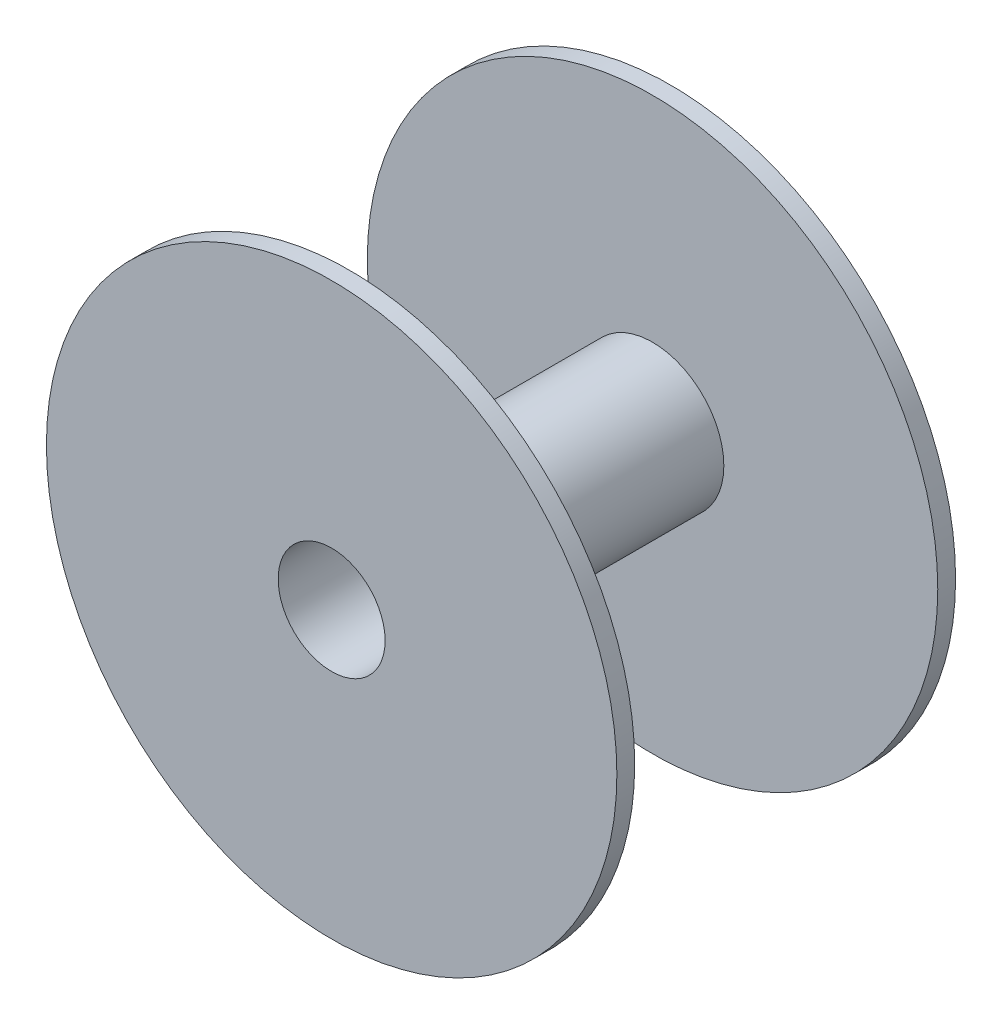
ISO-10303-21;
HEADER;
FILE_DESCRIPTION(('STEP AP214'),'2;1');
FILE_NAME('part.step','',(''),(''),'','','');
FILE_SCHEMA(('AUTOMOTIVE_DESIGN { 1 0 10303 214 1 1 1 1 }'));
ENDSEC;
DATA;
#1=APPLICATION_CONTEXT('core data for automotive mechanical design processes');
#2=APPLICATION_PROTOCOL_DEFINITION('international standard','automotive_design',2000,#1);
#3=PRODUCT_CONTEXT('',#1,'mechanical');
#4=PRODUCT('Part','Part','',(#3));
#5=PRODUCT_RELATED_PRODUCT_CATEGORY('part','',(#4));
#6=PRODUCT_DEFINITION_FORMATION('','',#4);
#7=PRODUCT_DEFINITION_CONTEXT('part definition',#1,'design');
#8=PRODUCT_DEFINITION('design','',#6,#7);
#9=PRODUCT_DEFINITION_SHAPE('','',#8);
#10=(LENGTH_UNIT() NAMED_UNIT(*) SI_UNIT(.MILLI.,.METRE.));
#11=(NAMED_UNIT(*) PLANE_ANGLE_UNIT() SI_UNIT($,.RADIAN.));
#12=(NAMED_UNIT(*) SI_UNIT($,.STERADIAN.) SOLID_ANGLE_UNIT());
#13=UNCERTAINTY_MEASURE_WITH_UNIT(LENGTH_MEASURE(1.E-05),#10,'distance_accuracy_value','');
#14=(GEOMETRIC_REPRESENTATION_CONTEXT(3) GLOBAL_UNCERTAINTY_ASSIGNED_CONTEXT((#13)) GLOBAL_UNIT_ASSIGNED_CONTEXT((#10,
#11,#12)) REPRESENTATION_CONTEXT('',''));
#15=CARTESIAN_POINT('',(0.,0.,0.));
#16=DIRECTION('',(0.,0.,1.));
#17=DIRECTION('',(1.,0.,0.));
#18=AXIS2_PLACEMENT_3D('',#15,#16,#17);
#19=CARTESIAN_POINT('',(0.,0.,95.));
#20=DIRECTION('',(0.,0.,-1.));
#21=DIRECTION('',(-1.,0.,0.));
#22=AXIS2_PLACEMENT_3D('',#19,#20,#21);
#23=CYLINDRICAL_SURFACE('',#22,80.);
#24=CARTESIAN_POINT('',(0.,0.,0.));
#25=DIRECTION('',(0.,0.,1.));
#26=DIRECTION('',(1.,0.,0.));
#27=AXIS2_PLACEMENT_3D('',#24,#25,#26);
#28=CIRCLE('',#27,80.);
#29=CARTESIAN_POINT('',(80.,0.,0.));
#30=VERTEX_POINT('',#29);
#31=EDGE_CURVE('E35',#30,#30,#28,.T.);
#32=ORIENTED_EDGE('',*,*,#31,.T.);
#33=EDGE_LOOP('',(#32));
#34=FACE_BOUND('',#33,.T.);
#35=CARTESIAN_POINT('',(0.,0.,5.));
#36=DIRECTION('',(0.,0.,1.));
#37=DIRECTION('',(1.,0.,0.));
#38=AXIS2_PLACEMENT_3D('',#35,#36,#37);
#39=CIRCLE('',#38,80.);
#40=CARTESIAN_POINT('',(80.,0.,5.));
#41=VERTEX_POINT('',#40);
#42=EDGE_CURVE('E50',#41,#41,#39,.T.);
#43=ORIENTED_EDGE('',*,*,#42,.F.);
#44=EDGE_LOOP('',(#43));
#45=FACE_BOUND('',#44,.T.);
#46=ADVANCED_FACE('F31',(#34,#45),#23,.T.);
#47=CARTESIAN_POINT('',(0.,0.,95.));
#48=DIRECTION('',(0.,0.,1.));
#49=DIRECTION('',(1.,0.,0.));
#50=AXIS2_PLACEMENT_3D('',#47,#48,#49);
#51=PLANE('',#50);
#52=CARTESIAN_POINT('',(0.,0.,95.));
#53=DIRECTION('',(0.,0.,1.));
#54=DIRECTION('',(1.,0.,0.));
#55=AXIS2_PLACEMENT_3D('',#52,#53,#54);
#56=CIRCLE('',#55,80.);
#57=CARTESIAN_POINT('',(80.,0.,95.));
#58=VERTEX_POINT('',#57);
#59=EDGE_CURVE('E10',#58,#58,#56,.T.);
#60=ORIENTED_EDGE('',*,*,#59,.T.);
#61=EDGE_LOOP('',(#60));
#62=FACE_BOUND('',#61,.T.);
#63=CARTESIAN_POINT('',(0.,0.,95.));
#64=DIRECTION('',(0.,0.,1.));
#65=DIRECTION('',(1.,0.,0.));
#66=AXIS2_PLACEMENT_3D('',#63,#64,#65);
#67=CIRCLE('',#66,15.);
#68=CARTESIAN_POINT('',(15.,0.,95.));
#69=VERTEX_POINT('',#68);
#70=EDGE_CURVE('E42',#69,#69,#67,.T.);
#71=ORIENTED_EDGE('',*,*,#70,.F.);
#72=EDGE_LOOP('',(#71));
#73=FACE_BOUND('',#72,.T.);
#74=ADVANCED_FACE('F81',(#62,#73),#51,.T.);
#75=CARTESIAN_POINT('',(0.,0.,0.));
#76=DIRECTION('',(0.,0.,1.));
#77=DIRECTION('',(1.,0.,0.));
#78=AXIS2_PLACEMENT_3D('',#75,#76,#77);
#79=PLANE('',#78);
#80=ORIENTED_EDGE('',*,*,#31,.F.);
#81=EDGE_LOOP('',(#80));
#82=FACE_BOUND('',#81,.T.);
#83=CARTESIAN_POINT('',(0.,0.,0.));
#84=DIRECTION('',(0.,0.,1.));
#85=DIRECTION('',(1.,0.,0.));
#86=AXIS2_PLACEMENT_3D('',#83,#84,#85);
#87=CIRCLE('',#86,15.);
#88=CARTESIAN_POINT('',(15.,0.,0.));
#89=VERTEX_POINT('',#88);
#90=EDGE_CURVE('E44',#89,#89,#87,.T.);
#91=ORIENTED_EDGE('',*,*,#90,.T.);
#92=EDGE_LOOP('',(#91));
#93=FACE_BOUND('',#92,.T.);
#94=ADVANCED_FACE('F86',(#82,#93),#79,.F.);
#95=CARTESIAN_POINT('',(0.,0.,90.));
#96=DIRECTION('',(0.,0.,1.));
#97=DIRECTION('',(1.,0.,0.));
#98=AXIS2_PLACEMENT_3D('',#95,#96,#97);
#99=CIRCLE('',#98,80.);
#100=CARTESIAN_POINT('',(80.,0.,90.));
#101=VERTEX_POINT('',#100);
#102=EDGE_CURVE('E47',#101,#101,#99,.T.);
#103=ORIENTED_EDGE('',*,*,#102,.T.);
#104=EDGE_LOOP('',(#103));
#105=FACE_BOUND('',#104,.T.);
#106=ORIENTED_EDGE('',*,*,#59,.F.);
#107=EDGE_LOOP('',(#106));
#108=FACE_BOUND('',#107,.T.);
#109=ADVANCED_FACE('F33',(#105,#108),#23,.T.);
#110=CARTESIAN_POINT('',(0.,0.,95.));
#111=DIRECTION('',(0.,0.,-1.));
#112=DIRECTION('',(-1.,0.,0.));
#113=AXIS2_PLACEMENT_3D('',#110,#111,#112);
#114=CYLINDRICAL_SURFACE('',#113,15.);
#115=ORIENTED_EDGE('',*,*,#70,.T.);
#116=EDGE_LOOP('',(#115));
#117=FACE_BOUND('',#116,.T.);
#118=ORIENTED_EDGE('',*,*,#90,.F.);
#119=EDGE_LOOP('',(#118));
#120=FACE_BOUND('',#119,.T.);
#121=ADVANCED_FACE('F77',(#117,#120),#114,.F.);
#122=CARTESIAN_POINT('',(0.,0.,90.));
#123=DIRECTION('',(0.,0.,1.));
#124=DIRECTION('',(1.,0.,0.));
#125=AXIS2_PLACEMENT_3D('',#122,#123,#124);
#126=PLANE('',#125);
#127=ORIENTED_EDGE('',*,*,#102,.F.);
#128=EDGE_LOOP('',(#127));
#129=FACE_BOUND('',#128,.T.);
#130=CARTESIAN_POINT('',(0.,0.,90.));
#131=DIRECTION('',(0.,0.,1.));
#132=DIRECTION('',(1.,0.,0.));
#133=AXIS2_PLACEMENT_3D('',#130,#131,#132);
#134=CIRCLE('',#133,20.);
#135=CARTESIAN_POINT('',(20.,0.,90.));
#136=VERTEX_POINT('',#135);
#137=EDGE_CURVE('E53',#136,#136,#134,.T.);
#138=ORIENTED_EDGE('',*,*,#137,.T.);
#139=EDGE_LOOP('',(#138));
#140=FACE_BOUND('',#139,.T.);
#141=ADVANCED_FACE('F62',(#129,#140),#126,.F.);
#142=CARTESIAN_POINT('',(0.,0.,5.));
#143=DIRECTION('',(0.,0.,1.));
#144=DIRECTION('',(1.,0.,0.));
#145=AXIS2_PLACEMENT_3D('',#142,#143,#144);
#146=PLANE('',#145);
#147=ORIENTED_EDGE('',*,*,#42,.T.);
#148=EDGE_LOOP('',(#147));
#149=FACE_BOUND('',#148,.T.);
#150=CARTESIAN_POINT('',(0.,0.,5.));
#151=DIRECTION('',(0.,0.,1.));
#152=DIRECTION('',(1.,0.,0.));
#153=AXIS2_PLACEMENT_3D('',#150,#151,#152);
#154=CIRCLE('',#153,20.);
#155=CARTESIAN_POINT('',(20.,0.,5.));
#156=VERTEX_POINT('',#155);
#157=EDGE_CURVE('E56',#156,#156,#154,.T.);
#158=ORIENTED_EDGE('',*,*,#157,.F.);
#159=EDGE_LOOP('',(#158));
#160=FACE_BOUND('',#159,.T.);
#161=ADVANCED_FACE('F67',(#149,#160),#146,.T.);
#162=CARTESIAN_POINT('',(0.,0.,95.));
#163=DIRECTION('',(0.,0.,-1.));
#164=DIRECTION('',(-1.,0.,0.));
#165=AXIS2_PLACEMENT_3D('',#162,#163,#164);
#166=CYLINDRICAL_SURFACE('',#165,20.);
#167=ORIENTED_EDGE('',*,*,#137,.F.);
#168=EDGE_LOOP('',(#167));
#169=FACE_BOUND('',#168,.T.);
#170=ORIENTED_EDGE('',*,*,#157,.T.);
#171=EDGE_LOOP('',(#170));
#172=FACE_BOUND('',#171,.T.);
#173=ADVANCED_FACE('F64',(#169,#172),#166,.T.);
#174=CLOSED_SHELL('',(#46,#74,#94,#109,#121,#141,#161,#173));
#175=MANIFOLD_SOLID_BREP('B2',#174);
#176=ADVANCED_BREP_SHAPE_REPRESENTATION('',(#18,#175),#14);
#177=SHAPE_DEFINITION_REPRESENTATION(#9,#176);
ENDSEC;
END-ISO-10303-21;
